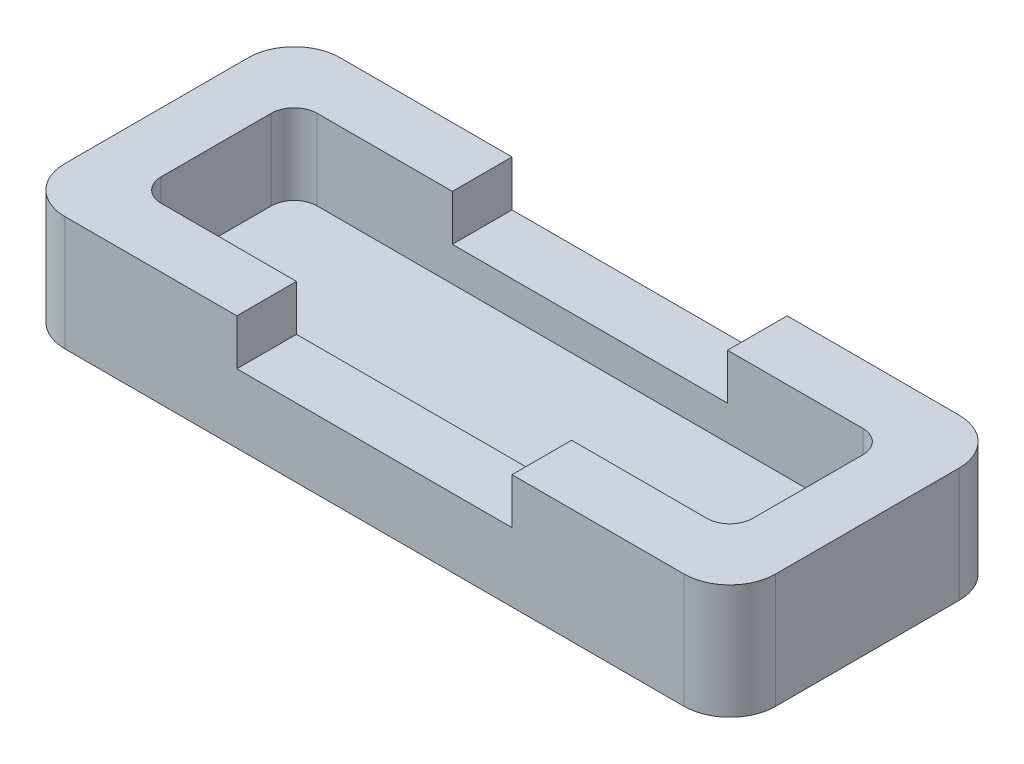
ISO-10303-21;
HEADER;
FILE_DESCRIPTION(('STEP AP214'),'2;1');
FILE_NAME('part.step','',(''),(''),'','','');
FILE_SCHEMA(('AUTOMOTIVE_DESIGN { 1 0 10303 214 1 1 1 1 }'));
ENDSEC;
DATA;
#1=APPLICATION_CONTEXT('core data for automotive mechanical design processes');
#2=APPLICATION_PROTOCOL_DEFINITION('international standard','automotive_design',2000,#1);
#3=PRODUCT_CONTEXT('',#1,'mechanical');
#4=PRODUCT('Part','Part','',(#3));
#5=PRODUCT_RELATED_PRODUCT_CATEGORY('part','',(#4));
#6=PRODUCT_DEFINITION_FORMATION('','',#4);
#7=PRODUCT_DEFINITION_CONTEXT('part definition',#1,'design');
#8=PRODUCT_DEFINITION('design','',#6,#7);
#9=PRODUCT_DEFINITION_SHAPE('','',#8);
#10=(LENGTH_UNIT() NAMED_UNIT(*) SI_UNIT(.MILLI.,.METRE.));
#11=(NAMED_UNIT(*) PLANE_ANGLE_UNIT() SI_UNIT($,.RADIAN.));
#12=(NAMED_UNIT(*) SI_UNIT($,.STERADIAN.) SOLID_ANGLE_UNIT());
#13=UNCERTAINTY_MEASURE_WITH_UNIT(LENGTH_MEASURE(1.E-05),#10,'distance_accuracy_value','');
#14=(GEOMETRIC_REPRESENTATION_CONTEXT(3) GLOBAL_UNCERTAINTY_ASSIGNED_CONTEXT((#13)) GLOBAL_UNIT_ASSIGNED_CONTEXT((#10,
#11,#12)) REPRESENTATION_CONTEXT('',''));
#15=CARTESIAN_POINT('',(0.,0.,0.));
#16=DIRECTION('',(0.,0.,1.));
#17=DIRECTION('',(1.,0.,0.));
#18=AXIS2_PLACEMENT_3D('',#15,#16,#17);
#19=CARTESIAN_POINT('',(0.,5.,0.));
#20=DIRECTION('',(0.,1.,0.));
#21=DIRECTION('',(0.,0.,1.));
#22=AXIS2_PLACEMENT_3D('',#19,#20,#21);
#23=PLANE('',#22);
#24=DIRECTION('',(1.,0.,0.));
#25=VECTOR('',#24,1.);
#26=CARTESIAN_POINT('',(-15.5,5.,6.));
#27=LINE('',#26,#25);
#28=CARTESIAN_POINT('',(6.,5.,6.));
#29=VERTEX_POINT('',#28);
#30=CARTESIAN_POINT('',(13.5,5.,6.));
#31=VERTEX_POINT('',#30);
#32=EDGE_CURVE('E280',#29,#31,#27,.T.);
#33=ORIENTED_EDGE('',*,*,#32,.T.);
#34=CARTESIAN_POINT('',(13.5,5.,4.));
#35=DIRECTION('',(0.,1.,0.));
#36=DIRECTION('',(0.,0.,1.));
#37=AXIS2_PLACEMENT_3D('',#34,#35,#36);
#38=CIRCLE('',#37,2.);
#39=CARTESIAN_POINT('',(15.5,5.,4.));
#40=VERTEX_POINT('',#39);
#41=EDGE_CURVE('E321',#31,#40,#38,.T.);
#42=ORIENTED_EDGE('',*,*,#41,.T.);
#43=DIRECTION('',(0.,0.,-1.));
#44=VECTOR('',#43,1.);
#45=CARTESIAN_POINT('',(15.5,5.,-6.));
#46=LINE('',#45,#44);
#47=CARTESIAN_POINT('',(15.5,5.,-4.));
#48=VERTEX_POINT('',#47);
#49=EDGE_CURVE('E270',#40,#48,#46,.T.);
#50=ORIENTED_EDGE('',*,*,#49,.T.);
#51=CARTESIAN_POINT('',(13.5,5.,-4.));
#52=DIRECTION('',(0.,1.,0.));
#53=DIRECTION('',(0.,0.,1.));
#54=AXIS2_PLACEMENT_3D('',#51,#52,#53);
#55=CIRCLE('',#54,2.);
#56=CARTESIAN_POINT('',(13.5,5.,-6.));
#57=VERTEX_POINT('',#56);
#58=EDGE_CURVE('E319',#48,#57,#55,.T.);
#59=ORIENTED_EDGE('',*,*,#58,.T.);
#60=DIRECTION('',(-1.,0.,0.));
#61=VECTOR('',#60,1.);
#62=CARTESIAN_POINT('',(-15.5,5.,-6.));
#63=LINE('',#62,#61);
#64=CARTESIAN_POINT('',(6.,5.,-6.));
#65=VERTEX_POINT('',#64);
#66=EDGE_CURVE('E275',#57,#65,#63,.T.);
#67=ORIENTED_EDGE('',*,*,#66,.T.);
#68=DIRECTION('',(0.,0.,-1.));
#69=VECTOR('',#68,1.);
#70=CARTESIAN_POINT('',(6.,5.,6.));
#71=LINE('',#70,#69);
#72=CARTESIAN_POINT('',(6.,5.,-3.4));
#73=VERTEX_POINT('',#72);
#74=EDGE_CURVE('E215',#73,#65,#71,.T.);
#75=ORIENTED_EDGE('',*,*,#74,.F.);
#76=DIRECTION('',(-1.,0.,0.));
#77=VECTOR('',#76,1.);
#78=CARTESIAN_POINT('',(-15.5,5.,-3.4));
#79=LINE('',#78,#77);
#80=CARTESIAN_POINT('',(11.9,5.,-3.4));
#81=VERTEX_POINT('',#80);
#82=EDGE_CURVE('E261',#81,#73,#79,.T.);
#83=ORIENTED_EDGE('',*,*,#82,.F.);
#84=CARTESIAN_POINT('',(11.9,5.,-2.4));
#85=DIRECTION('',(0.,1.,0.));
#86=DIRECTION('',(0.,0.,1.));
#87=AXIS2_PLACEMENT_3D('',#84,#85,#86);
#88=CIRCLE('',#87,1.);
#89=CARTESIAN_POINT('',(12.9,5.,-2.4));
#90=VERTEX_POINT('',#89);
#91=EDGE_CURVE('E11',#81,#90,#88,.F.);
#92=ORIENTED_EDGE('',*,*,#91,.T.);
#93=DIRECTION('',(0.,0.,-1.));
#94=VECTOR('',#93,1.);
#95=CARTESIAN_POINT('',(12.9,5.,-6.));
#96=LINE('',#95,#94);
#97=CARTESIAN_POINT('',(12.9,5.,2.4));
#98=VERTEX_POINT('',#97);
#99=EDGE_CURVE('E258',#98,#90,#96,.T.);
#100=ORIENTED_EDGE('',*,*,#99,.F.);
#101=CARTESIAN_POINT('',(11.9,5.,2.4));
#102=DIRECTION('',(0.,1.,0.));
#103=DIRECTION('',(0.,0.,1.));
#104=AXIS2_PLACEMENT_3D('',#101,#102,#103);
#105=CIRCLE('',#104,1.);
#106=CARTESIAN_POINT('',(11.9,5.,3.4));
#107=VERTEX_POINT('',#106);
#108=EDGE_CURVE('E43',#98,#107,#105,.F.);
#109=ORIENTED_EDGE('',*,*,#108,.T.);
#110=DIRECTION('',(1.,0.,0.));
#111=VECTOR('',#110,1.);
#112=CARTESIAN_POINT('',(-15.5,5.,3.4));
#113=LINE('',#112,#111);
#114=CARTESIAN_POINT('',(6.,5.,3.4));
#115=VERTEX_POINT('',#114);
#116=EDGE_CURVE('E266',#115,#107,#113,.T.);
#117=ORIENTED_EDGE('',*,*,#116,.F.);
#118=EDGE_CURVE('E230',#29,#115,#71,.T.);
#119=ORIENTED_EDGE('',*,*,#118,.F.);
#120=EDGE_LOOP('',(#33,#42,#50,#59,#67,#75,#83,#92,#100,#109,#117,#119));
#121=FACE_BOUND('',#120,.T.);
#122=ADVANCED_FACE('F35',(#121),#23,.T.);
#123=CARTESIAN_POINT('',(15.5,5.,-6.));
#124=DIRECTION('',(-1.,0.,0.));
#125=DIRECTION('',(0.,0.,1.));
#126=AXIS2_PLACEMENT_3D('',#123,#124,#125);
#127=PLANE('',#126);
#128=ORIENTED_EDGE('',*,*,#49,.F.);
#129=DIRECTION('',(0.,-1.,0.));
#130=VECTOR('',#129,1.);
#131=CARTESIAN_POINT('',(15.5,5.,4.));
#132=LINE('',#131,#130);
#133=CARTESIAN_POINT('',(15.5,0.,4.));
#134=VERTEX_POINT('',#133);
#135=EDGE_CURVE('E303',#40,#134,#132,.T.);
#136=ORIENTED_EDGE('',*,*,#135,.T.);
#137=DIRECTION('',(0.,0.,-1.));
#138=VECTOR('',#137,1.);
#139=CARTESIAN_POINT('',(15.5,0.,-6.));
#140=LINE('',#139,#138);
#141=CARTESIAN_POINT('',(15.5,0.,-4.));
#142=VERTEX_POINT('',#141);
#143=EDGE_CURVE('E269',#134,#142,#140,.T.);
#144=ORIENTED_EDGE('',*,*,#143,.T.);
#145=DIRECTION('',(0.,-1.,0.));
#146=VECTOR('',#145,1.);
#147=CARTESIAN_POINT('',(15.5,5.,-4.));
#148=LINE('',#147,#146);
#149=EDGE_CURVE('E301',#142,#48,#148,.F.);
#150=ORIENTED_EDGE('',*,*,#149,.T.);
#151=EDGE_LOOP('',(#128,#136,#144,#150));
#152=FACE_BOUND('',#151,.T.);
#153=ADVANCED_FACE('F437',(#152),#127,.F.);
#154=CARTESIAN_POINT('',(-15.5,5.,-6.));
#155=DIRECTION('',(0.,0.,1.));
#156=DIRECTION('',(1.,0.,0.));
#157=AXIS2_PLACEMENT_3D('',#154,#155,#156);
#158=PLANE('',#157);
#159=ORIENTED_EDGE('',*,*,#66,.F.);
#160=DIRECTION('',(0.,-1.,0.));
#161=VECTOR('',#160,1.);
#162=CARTESIAN_POINT('',(13.5,5.,-6.));
#163=LINE('',#162,#161);
#164=CARTESIAN_POINT('',(13.5,0.,-6.));
#165=VERTEX_POINT('',#164);
#166=EDGE_CURVE('E325',#57,#165,#163,.T.);
#167=ORIENTED_EDGE('',*,*,#166,.T.);
#168=DIRECTION('',(-1.,0.,0.));
#169=VECTOR('',#168,1.);
#170=CARTESIAN_POINT('',(-15.5,0.,-6.));
#171=LINE('',#170,#169);
#172=CARTESIAN_POINT('',(-13.5,0.,-6.));
#173=VERTEX_POINT('',#172);
#174=EDGE_CURVE('E286',#165,#173,#171,.T.);
#175=ORIENTED_EDGE('',*,*,#174,.T.);
#176=DIRECTION('',(0.,-1.,0.));
#177=VECTOR('',#176,1.);
#178=CARTESIAN_POINT('',(-13.5,5.,-6.));
#179=LINE('',#178,#177);
#180=CARTESIAN_POINT('',(-13.5,5.,-6.));
#181=VERTEX_POINT('',#180);
#182=EDGE_CURVE('E323',#173,#181,#179,.F.);
#183=ORIENTED_EDGE('',*,*,#182,.T.);
#184=CARTESIAN_POINT('',(-6.,5.,-6.));
#185=VERTEX_POINT('',#184);
#186=EDGE_CURVE('E273',#185,#181,#63,.T.);
#187=ORIENTED_EDGE('',*,*,#186,.F.);
#188=DIRECTION('',(0.,1.,0.));
#189=VECTOR('',#188,1.);
#190=CARTESIAN_POINT('',(-6.,3.,-6.));
#191=LINE('',#190,#189);
#192=CARTESIAN_POINT('',(-6.,3.,-6.));
#193=VERTEX_POINT('',#192);
#194=EDGE_CURVE('E218',#193,#185,#191,.T.);
#195=ORIENTED_EDGE('',*,*,#194,.F.);
#196=DIRECTION('',(-1.,0.,0.));
#197=VECTOR('',#196,1.);
#198=CARTESIAN_POINT('',(-6.,3.,-6.));
#199=LINE('',#198,#197);
#200=CARTESIAN_POINT('',(6.,3.,-6.));
#201=VERTEX_POINT('',#200);
#202=EDGE_CURVE('E200',#201,#193,#199,.T.);
#203=ORIENTED_EDGE('',*,*,#202,.F.);
#204=DIRECTION('',(0.,1.,0.));
#205=VECTOR('',#204,1.);
#206=CARTESIAN_POINT('',(6.,3.,-6.));
#207=LINE('',#206,#205);
#208=EDGE_CURVE('E212',#201,#65,#207,.T.);
#209=ORIENTED_EDGE('',*,*,#208,.T.);
#210=EDGE_LOOP('',(#159,#167,#175,#183,#187,#195,#203,#209));
#211=FACE_BOUND('',#210,.T.);
#212=ADVANCED_FACE('F221',(#211),#158,.F.);
#213=CARTESIAN_POINT('',(-15.5,5.,-6.));
#214=DIRECTION('',(1.,0.,0.));
#215=DIRECTION('',(0.,0.,-1.));
#216=AXIS2_PLACEMENT_3D('',#213,#214,#215);
#217=PLANE('',#216);
#218=DIRECTION('',(0.,0.,1.));
#219=VECTOR('',#218,1.);
#220=CARTESIAN_POINT('',(-15.5,5.,-6.));
#221=LINE('',#220,#219);
#222=CARTESIAN_POINT('',(-15.5,5.,-4.));
#223=VERTEX_POINT('',#222);
#224=CARTESIAN_POINT('',(-15.5,5.,4.));
#225=VERTEX_POINT('',#224);
#226=EDGE_CURVE('E277',#223,#225,#221,.T.);
#227=ORIENTED_EDGE('',*,*,#226,.F.);
#228=DIRECTION('',(0.,-1.,0.));
#229=VECTOR('',#228,1.);
#230=CARTESIAN_POINT('',(-15.5,5.,-4.));
#231=LINE('',#230,#229);
#232=CARTESIAN_POINT('',(-15.5,0.,-4.));
#233=VERTEX_POINT('',#232);
#234=EDGE_CURVE('E330',#223,#233,#231,.T.);
#235=ORIENTED_EDGE('',*,*,#234,.T.);
#236=DIRECTION('',(0.,0.,1.));
#237=VECTOR('',#236,1.);
#238=CARTESIAN_POINT('',(-15.5,0.,-6.));
#239=LINE('',#238,#237);
#240=CARTESIAN_POINT('',(-15.5,0.,4.));
#241=VERTEX_POINT('',#240);
#242=EDGE_CURVE('E289',#233,#241,#239,.T.);
#243=ORIENTED_EDGE('',*,*,#242,.T.);
#244=DIRECTION('',(0.,-1.,0.));
#245=VECTOR('',#244,1.);
#246=CARTESIAN_POINT('',(-15.5,5.,4.));
#247=LINE('',#246,#245);
#248=EDGE_CURVE('E328',#241,#225,#247,.F.);
#249=ORIENTED_EDGE('',*,*,#248,.T.);
#250=EDGE_LOOP('',(#227,#235,#243,#249));
#251=FACE_BOUND('',#250,.T.);
#252=ADVANCED_FACE('F454',(#251),#217,.F.);
#253=CARTESIAN_POINT('',(-15.5,5.,6.));
#254=DIRECTION('',(0.,0.,-1.));
#255=DIRECTION('',(-1.,0.,0.));
#256=AXIS2_PLACEMENT_3D('',#253,#254,#255);
#257=PLANE('',#256);
#258=DIRECTION('',(1.,0.,0.));
#259=VECTOR('',#258,1.);
#260=CARTESIAN_POINT('',(-15.5,0.,6.));
#261=LINE('',#260,#259);
#262=CARTESIAN_POINT('',(-13.5,0.,6.));
#263=VERTEX_POINT('',#262);
#264=CARTESIAN_POINT('',(13.5,0.,6.));
#265=VERTEX_POINT('',#264);
#266=EDGE_CURVE('E274',#263,#265,#261,.T.);
#267=ORIENTED_EDGE('',*,*,#266,.T.);
#268=DIRECTION('',(0.,-1.,0.));
#269=VECTOR('',#268,1.);
#270=CARTESIAN_POINT('',(13.5,5.,6.));
#271=LINE('',#270,#269);
#272=EDGE_CURVE('E317',#265,#31,#271,.F.);
#273=ORIENTED_EDGE('',*,*,#272,.T.);
#274=ORIENTED_EDGE('',*,*,#32,.F.);
#275=DIRECTION('',(0.,1.,0.));
#276=VECTOR('',#275,1.);
#277=CARTESIAN_POINT('',(6.,3.,6.));
#278=LINE('',#277,#276);
#279=CARTESIAN_POINT('',(6.,3.,6.));
#280=VERTEX_POINT('',#279);
#281=EDGE_CURVE('E234',#280,#29,#278,.T.);
#282=ORIENTED_EDGE('',*,*,#281,.F.);
#283=DIRECTION('',(1.,0.,0.));
#284=VECTOR('',#283,1.);
#285=CARTESIAN_POINT('',(-6.,3.,6.));
#286=LINE('',#285,#284);
#287=CARTESIAN_POINT('',(-6.,3.,6.));
#288=VERTEX_POINT('',#287);
#289=EDGE_CURVE('E219',#288,#280,#286,.T.);
#290=ORIENTED_EDGE('',*,*,#289,.F.);
#291=DIRECTION('',(0.,1.,0.));
#292=VECTOR('',#291,1.);
#293=CARTESIAN_POINT('',(-6.,3.,6.));
#294=LINE('',#293,#292);
#295=CARTESIAN_POINT('',(-6.,5.,6.));
#296=VERTEX_POINT('',#295);
#297=EDGE_CURVE('E236',#288,#296,#294,.T.);
#298=ORIENTED_EDGE('',*,*,#297,.T.);
#299=CARTESIAN_POINT('',(-13.5,5.,6.));
#300=VERTEX_POINT('',#299);
#301=EDGE_CURVE('E281',#300,#296,#27,.T.);
#302=ORIENTED_EDGE('',*,*,#301,.F.);
#303=DIRECTION('',(0.,-1.,0.));
#304=VECTOR('',#303,1.);
#305=CARTESIAN_POINT('',(-13.5,5.,6.));
#306=LINE('',#305,#304);
#307=EDGE_CURVE('E314',#300,#263,#306,.T.);
#308=ORIENTED_EDGE('',*,*,#307,.T.);
#309=EDGE_LOOP('',(#267,#273,#274,#282,#290,#298,#302,#308));
#310=FACE_BOUND('',#309,.T.);
#311=ADVANCED_FACE('F420',(#310),#257,.F.);
#312=ORIENTED_EDGE('',*,*,#186,.T.);
#313=CARTESIAN_POINT('',(-13.5,5.,-4.));
#314=DIRECTION('',(0.,1.,0.));
#315=DIRECTION('',(0.,0.,1.));
#316=AXIS2_PLACEMENT_3D('',#313,#314,#315);
#317=CIRCLE('',#316,2.);
#318=EDGE_CURVE('E335',#181,#223,#317,.T.);
#319=ORIENTED_EDGE('',*,*,#318,.T.);
#320=ORIENTED_EDGE('',*,*,#226,.T.);
#321=CARTESIAN_POINT('',(-13.5,5.,4.));
#322=DIRECTION('',(0.,1.,0.));
#323=DIRECTION('',(0.,0.,1.));
#324=AXIS2_PLACEMENT_3D('',#321,#322,#323);
#325=CIRCLE('',#324,2.);
#326=EDGE_CURVE('E333',#225,#300,#325,.T.);
#327=ORIENTED_EDGE('',*,*,#326,.T.);
#328=ORIENTED_EDGE('',*,*,#301,.T.);
#329=DIRECTION('',(0.,0.,1.));
#330=VECTOR('',#329,1.);
#331=CARTESIAN_POINT('',(-6.,5.,6.));
#332=LINE('',#331,#330);
#333=CARTESIAN_POINT('',(-6.,5.,3.4));
#334=VERTEX_POINT('',#333);
#335=EDGE_CURVE('E232',#334,#296,#332,.T.);
#336=ORIENTED_EDGE('',*,*,#335,.F.);
#337=CARTESIAN_POINT('',(-11.9,5.,3.4));
#338=VERTEX_POINT('',#337);
#339=EDGE_CURVE('E267',#338,#334,#113,.T.);
#340=ORIENTED_EDGE('',*,*,#339,.F.);
#341=CARTESIAN_POINT('',(-11.9,5.,2.4));
#342=DIRECTION('',(0.,1.,0.));
#343=DIRECTION('',(0.,0.,1.));
#344=AXIS2_PLACEMENT_3D('',#341,#342,#343);
#345=CIRCLE('',#344,1.);
#346=CARTESIAN_POINT('',(-12.9,5.,2.4));
#347=VERTEX_POINT('',#346);
#348=EDGE_CURVE('E366',#338,#347,#345,.F.);
#349=ORIENTED_EDGE('',*,*,#348,.T.);
#350=DIRECTION('',(0.,0.,1.));
#351=VECTOR('',#350,1.);
#352=CARTESIAN_POINT('',(-12.9,5.,-6.));
#353=LINE('',#352,#351);
#354=CARTESIAN_POINT('',(-12.9,5.,-2.4));
#355=VERTEX_POINT('',#354);
#356=EDGE_CURVE('E263',#355,#347,#353,.T.);
#357=ORIENTED_EDGE('',*,*,#356,.F.);
#358=CARTESIAN_POINT('',(-11.9,5.,-2.4));
#359=DIRECTION('',(0.,1.,0.));
#360=DIRECTION('',(0.,0.,1.));
#361=AXIS2_PLACEMENT_3D('',#358,#359,#360);
#362=CIRCLE('',#361,1.);
#363=CARTESIAN_POINT('',(-11.9,5.,-3.4));
#364=VERTEX_POINT('',#363);
#365=EDGE_CURVE('E364',#355,#364,#362,.F.);
#366=ORIENTED_EDGE('',*,*,#365,.T.);
#367=CARTESIAN_POINT('',(-6.,5.,-3.4));
#368=VERTEX_POINT('',#367);
#369=EDGE_CURVE('E260',#368,#364,#79,.T.);
#370=ORIENTED_EDGE('',*,*,#369,.F.);
#371=EDGE_CURVE('E208',#185,#368,#332,.T.);
#372=ORIENTED_EDGE('',*,*,#371,.F.);
#373=EDGE_LOOP('',(#312,#319,#320,#327,#328,#336,#340,#349,#357,#366,#370,#372));
#374=FACE_BOUND('',#373,.T.);
#375=ADVANCED_FACE('F411',(#374),#23,.T.);
#376=CARTESIAN_POINT('',(0.,0.,0.));
#377=DIRECTION('',(0.,1.,0.));
#378=DIRECTION('',(0.,0.,1.));
#379=AXIS2_PLACEMENT_3D('',#376,#377,#378);
#380=PLANE('',#379);
#381=ORIENTED_EDGE('',*,*,#143,.F.);
#382=CARTESIAN_POINT('',(13.5,0.,4.));
#383=DIRECTION('',(0.,1.,0.));
#384=DIRECTION('',(0.,0.,1.));
#385=AXIS2_PLACEMENT_3D('',#382,#383,#384);
#386=CIRCLE('',#385,2.);
#387=EDGE_CURVE('E312',#134,#265,#386,.F.);
#388=ORIENTED_EDGE('',*,*,#387,.T.);
#389=ORIENTED_EDGE('',*,*,#266,.F.);
#390=CARTESIAN_POINT('',(-13.5,0.,4.));
#391=DIRECTION('',(0.,1.,0.));
#392=DIRECTION('',(0.,0.,1.));
#393=AXIS2_PLACEMENT_3D('',#390,#391,#392);
#394=CIRCLE('',#393,2.);
#395=EDGE_CURVE('E306',#263,#241,#394,.F.);
#396=ORIENTED_EDGE('',*,*,#395,.T.);
#397=ORIENTED_EDGE('',*,*,#242,.F.);
#398=CARTESIAN_POINT('',(-13.5,0.,-4.));
#399=DIRECTION('',(0.,1.,0.));
#400=DIRECTION('',(0.,0.,1.));
#401=AXIS2_PLACEMENT_3D('',#398,#399,#400);
#402=CIRCLE('',#401,2.);
#403=EDGE_CURVE('E308',#233,#173,#402,.F.);
#404=ORIENTED_EDGE('',*,*,#403,.T.);
#405=ORIENTED_EDGE('',*,*,#174,.F.);
#406=CARTESIAN_POINT('',(13.5,0.,-4.));
#407=DIRECTION('',(0.,1.,0.));
#408=DIRECTION('',(0.,0.,1.));
#409=AXIS2_PLACEMENT_3D('',#406,#407,#408);
#410=CIRCLE('',#409,2.);
#411=EDGE_CURVE('E310',#165,#142,#410,.F.);
#412=ORIENTED_EDGE('',*,*,#411,.T.);
#413=EDGE_LOOP('',(#381,#388,#389,#396,#397,#404,#405,#412));
#414=FACE_BOUND('',#413,.T.);
#415=ADVANCED_FACE('F446',(#414),#380,.F.);
#416=CARTESIAN_POINT('',(12.9,5.,-6.));
#417=DIRECTION('',(-1.,0.,0.));
#418=DIRECTION('',(0.,0.,1.));
#419=AXIS2_PLACEMENT_3D('',#416,#417,#418);
#420=PLANE('',#419);
#421=DIRECTION('',(0.,0.,-1.));
#422=VECTOR('',#421,1.);
#423=CARTESIAN_POINT('',(12.9,1.5,-6.));
#424=LINE('',#423,#422);
#425=CARTESIAN_POINT('',(12.9,1.5,2.4));
#426=VERTEX_POINT('',#425);
#427=CARTESIAN_POINT('',(12.9,1.5,-2.4));
#428=VERTEX_POINT('',#427);
#429=EDGE_CURVE('E246',#426,#428,#424,.T.);
#430=ORIENTED_EDGE('',*,*,#429,.F.);
#431=DIRECTION('',(0.,-1.,0.));
#432=VECTOR('',#431,1.);
#433=CARTESIAN_POINT('',(12.9,5.,2.4));
#434=LINE('',#433,#432);
#435=EDGE_CURVE('E55',#426,#98,#434,.F.);
#436=ORIENTED_EDGE('',*,*,#435,.T.);
#437=ORIENTED_EDGE('',*,*,#99,.T.);
#438=DIRECTION('',(0.,-1.,0.));
#439=VECTOR('',#438,1.);
#440=CARTESIAN_POINT('',(12.9,1.5,-2.4));
#441=LINE('',#440,#439);
#442=EDGE_CURVE('E360',#90,#428,#441,.T.);
#443=ORIENTED_EDGE('',*,*,#442,.T.);
#444=EDGE_LOOP('',(#430,#436,#437,#443));
#445=FACE_BOUND('',#444,.T.);
#446=ADVANCED_FACE('F382',(#445),#420,.T.);
#447=CARTESIAN_POINT('',(-15.5,5.,-3.4));
#448=DIRECTION('',(0.,0.,1.));
#449=DIRECTION('',(1.,0.,0.));
#450=AXIS2_PLACEMENT_3D('',#447,#448,#449);
#451=PLANE('',#450);
#452=ORIENTED_EDGE('',*,*,#369,.T.);
#453=DIRECTION('',(0.,-1.,0.));
#454=VECTOR('',#453,1.);
#455=CARTESIAN_POINT('',(-11.9,1.5,-3.4));
#456=LINE('',#455,#454);
#457=CARTESIAN_POINT('',(-11.9,1.5,-3.4));
#458=VERTEX_POINT('',#457);
#459=EDGE_CURVE('E339',#364,#458,#456,.T.);
#460=ORIENTED_EDGE('',*,*,#459,.T.);
#461=DIRECTION('',(-1.,0.,0.));
#462=VECTOR('',#461,1.);
#463=CARTESIAN_POINT('',(-15.5,1.5,-3.4));
#464=LINE('',#463,#462);
#465=CARTESIAN_POINT('',(11.9,1.5,-3.4));
#466=VERTEX_POINT('',#465);
#467=EDGE_CURVE('E249',#466,#458,#464,.T.);
#468=ORIENTED_EDGE('',*,*,#467,.F.);
#469=DIRECTION('',(0.,-1.,0.));
#470=VECTOR('',#469,1.);
#471=CARTESIAN_POINT('',(11.9,5.,-3.4));
#472=LINE('',#471,#470);
#473=EDGE_CURVE('E337',#466,#81,#472,.F.);
#474=ORIENTED_EDGE('',*,*,#473,.T.);
#475=ORIENTED_EDGE('',*,*,#82,.T.);
#476=DIRECTION('',(0.,1.,0.));
#477=VECTOR('',#476,1.);
#478=CARTESIAN_POINT('',(6.,5.,-3.4));
#479=LINE('',#478,#477);
#480=CARTESIAN_POINT('',(6.,3.,-3.4));
#481=VERTEX_POINT('',#480);
#482=EDGE_CURVE('E244',#481,#73,#479,.T.);
#483=ORIENTED_EDGE('',*,*,#482,.F.);
#484=DIRECTION('',(1.,0.,0.));
#485=VECTOR('',#484,1.);
#486=CARTESIAN_POINT('',(-15.5,3.,-3.4));
#487=LINE('',#486,#485);
#488=CARTESIAN_POINT('',(-6.,3.,-3.4));
#489=VERTEX_POINT('',#488);
#490=EDGE_CURVE('E203',#489,#481,#487,.T.);
#491=ORIENTED_EDGE('',*,*,#490,.F.);
#492=DIRECTION('',(0.,-1.,0.));
#493=VECTOR('',#492,1.);
#494=CARTESIAN_POINT('',(-6.,5.,-3.4));
#495=LINE('',#494,#493);
#496=EDGE_CURVE('E241',#368,#489,#495,.T.);
#497=ORIENTED_EDGE('',*,*,#496,.F.);
#498=EDGE_LOOP('',(#452,#460,#468,#474,#475,#483,#491,#497));
#499=FACE_BOUND('',#498,.T.);
#500=ADVANCED_FACE('F389',(#499),#451,.T.);
#501=CARTESIAN_POINT('',(-12.9,5.,-6.));
#502=DIRECTION('',(1.,0.,0.));
#503=DIRECTION('',(0.,0.,-1.));
#504=AXIS2_PLACEMENT_3D('',#501,#502,#503);
#505=PLANE('',#504);
#506=DIRECTION('',(0.,0.,1.));
#507=VECTOR('',#506,1.);
#508=CARTESIAN_POINT('',(-12.9,1.5,-6.));
#509=LINE('',#508,#507);
#510=CARTESIAN_POINT('',(-12.9,1.5,-2.4));
#511=VERTEX_POINT('',#510);
#512=CARTESIAN_POINT('',(-12.9,1.5,2.4));
#513=VERTEX_POINT('',#512);
#514=EDGE_CURVE('E252',#511,#513,#509,.T.);
#515=ORIENTED_EDGE('',*,*,#514,.F.);
#516=DIRECTION('',(0.,-1.,0.));
#517=VECTOR('',#516,1.);
#518=CARTESIAN_POINT('',(-12.9,5.,-2.4));
#519=LINE('',#518,#517);
#520=EDGE_CURVE('E353',#511,#355,#519,.F.);
#521=ORIENTED_EDGE('',*,*,#520,.T.);
#522=ORIENTED_EDGE('',*,*,#356,.T.);
#523=DIRECTION('',(0.,-1.,0.));
#524=VECTOR('',#523,1.);
#525=CARTESIAN_POINT('',(-12.9,1.5,2.4));
#526=LINE('',#525,#524);
#527=EDGE_CURVE('E350',#347,#513,#526,.T.);
#528=ORIENTED_EDGE('',*,*,#527,.T.);
#529=EDGE_LOOP('',(#515,#521,#522,#528));
#530=FACE_BOUND('',#529,.T.);
#531=ADVANCED_FACE('F399',(#530),#505,.T.);
#532=CARTESIAN_POINT('',(-15.5,5.,3.4));
#533=DIRECTION('',(0.,0.,-1.));
#534=DIRECTION('',(-1.,0.,0.));
#535=AXIS2_PLACEMENT_3D('',#532,#533,#534);
#536=PLANE('',#535);
#537=DIRECTION('',(1.,0.,0.));
#538=VECTOR('',#537,1.);
#539=CARTESIAN_POINT('',(-15.5,1.5,3.4));
#540=LINE('',#539,#538);
#541=CARTESIAN_POINT('',(-11.9,1.5,3.4));
#542=VERTEX_POINT('',#541);
#543=CARTESIAN_POINT('',(11.9,1.5,3.4));
#544=VERTEX_POINT('',#543);
#545=EDGE_CURVE('E255',#542,#544,#540,.T.);
#546=ORIENTED_EDGE('',*,*,#545,.F.);
#547=DIRECTION('',(0.,-1.,0.));
#548=VECTOR('',#547,1.);
#549=CARTESIAN_POINT('',(-11.9,5.,3.4));
#550=LINE('',#549,#548);
#551=EDGE_CURVE('E358',#542,#338,#550,.F.);
#552=ORIENTED_EDGE('',*,*,#551,.T.);
#553=ORIENTED_EDGE('',*,*,#339,.T.);
#554=DIRECTION('',(0.,1.,0.));
#555=VECTOR('',#554,1.);
#556=CARTESIAN_POINT('',(-6.,5.,3.4));
#557=LINE('',#556,#555);
#558=CARTESIAN_POINT('',(-6.,3.,3.4));
#559=VERTEX_POINT('',#558);
#560=EDGE_CURVE('E295',#559,#334,#557,.T.);
#561=ORIENTED_EDGE('',*,*,#560,.F.);
#562=DIRECTION('',(-1.,0.,0.));
#563=VECTOR('',#562,1.);
#564=CARTESIAN_POINT('',(-15.5,3.,3.4));
#565=LINE('',#564,#563);
#566=CARTESIAN_POINT('',(6.,3.,3.4));
#567=VERTEX_POINT('',#566);
#568=EDGE_CURVE('E283',#567,#559,#565,.T.);
#569=ORIENTED_EDGE('',*,*,#568,.F.);
#570=DIRECTION('',(0.,-1.,0.));
#571=VECTOR('',#570,1.);
#572=CARTESIAN_POINT('',(6.,5.,3.4));
#573=LINE('',#572,#571);
#574=EDGE_CURVE('E298',#115,#567,#573,.T.);
#575=ORIENTED_EDGE('',*,*,#574,.F.);
#576=ORIENTED_EDGE('',*,*,#116,.T.);
#577=DIRECTION('',(0.,-1.,0.));
#578=VECTOR('',#577,1.);
#579=CARTESIAN_POINT('',(11.9,1.5,3.4));
#580=LINE('',#579,#578);
#581=EDGE_CURVE('E355',#107,#544,#580,.T.);
#582=ORIENTED_EDGE('',*,*,#581,.T.);
#583=EDGE_LOOP('',(#546,#552,#553,#561,#569,#575,#576,#582));
#584=FACE_BOUND('',#583,.T.);
#585=ADVANCED_FACE('F377',(#584),#536,.T.);
#586=CARTESIAN_POINT('',(0.,1.5,0.));
#587=DIRECTION('',(0.,1.,0.));
#588=DIRECTION('',(0.,0.,1.));
#589=AXIS2_PLACEMENT_3D('',#586,#587,#588);
#590=PLANE('',#589);
#591=ORIENTED_EDGE('',*,*,#467,.T.);
#592=CARTESIAN_POINT('',(-11.9,1.5,-2.4));
#593=DIRECTION('',(0.,1.,0.));
#594=DIRECTION('',(0.,0.,1.));
#595=AXIS2_PLACEMENT_3D('',#592,#593,#594);
#596=CIRCLE('',#595,1.);
#597=EDGE_CURVE('E348',#458,#511,#596,.T.);
#598=ORIENTED_EDGE('',*,*,#597,.T.);
#599=ORIENTED_EDGE('',*,*,#514,.T.);
#600=CARTESIAN_POINT('',(-11.9,1.5,2.4));
#601=DIRECTION('',(0.,1.,0.));
#602=DIRECTION('',(0.,0.,1.));
#603=AXIS2_PLACEMENT_3D('',#600,#601,#602);
#604=CIRCLE('',#603,1.);
#605=EDGE_CURVE('E346',#513,#542,#604,.T.);
#606=ORIENTED_EDGE('',*,*,#605,.T.);
#607=ORIENTED_EDGE('',*,*,#545,.T.);
#608=CARTESIAN_POINT('',(11.9,1.5,2.4));
#609=DIRECTION('',(0.,1.,0.));
#610=DIRECTION('',(0.,0.,1.));
#611=AXIS2_PLACEMENT_3D('',#608,#609,#610);
#612=CIRCLE('',#611,1.);
#613=EDGE_CURVE('E344',#544,#426,#612,.T.);
#614=ORIENTED_EDGE('',*,*,#613,.T.);
#615=ORIENTED_EDGE('',*,*,#429,.T.);
#616=CARTESIAN_POINT('',(11.9,1.5,-2.4));
#617=DIRECTION('',(0.,1.,0.));
#618=DIRECTION('',(0.,0.,1.));
#619=AXIS2_PLACEMENT_3D('',#616,#617,#618);
#620=CIRCLE('',#619,1.);
#621=EDGE_CURVE('E342',#428,#466,#620,.T.);
#622=ORIENTED_EDGE('',*,*,#621,.T.);
#623=EDGE_LOOP('',(#591,#598,#599,#606,#607,#614,#615,#622));
#624=FACE_BOUND('',#623,.T.);
#625=ADVANCED_FACE('F381',(#624),#590,.T.);
#626=CARTESIAN_POINT('',(0.,3.,0.));
#627=DIRECTION('',(0.,-1.,0.));
#628=DIRECTION('',(0.,0.,-1.));
#629=AXIS2_PLACEMENT_3D('',#626,#627,#628);
#630=PLANE('',#629);
#631=ORIENTED_EDGE('',*,*,#568,.T.);
#632=DIRECTION('',(0.,0.,1.));
#633=VECTOR('',#632,1.);
#634=CARTESIAN_POINT('',(-6.,3.,6.));
#635=LINE('',#634,#633);
#636=EDGE_CURVE('E223',#559,#288,#635,.T.);
#637=ORIENTED_EDGE('',*,*,#636,.T.);
#638=ORIENTED_EDGE('',*,*,#289,.T.);
#639=DIRECTION('',(0.,0.,-1.));
#640=VECTOR('',#639,1.);
#641=CARTESIAN_POINT('',(6.,3.,6.));
#642=LINE('',#641,#640);
#643=EDGE_CURVE('E207',#280,#567,#642,.T.);
#644=ORIENTED_EDGE('',*,*,#643,.T.);
#645=EDGE_LOOP('',(#631,#637,#638,#644));
#646=FACE_BOUND('',#645,.T.);
#647=ADVANCED_FACE('F425',(#646),#630,.F.);
#648=CARTESIAN_POINT('',(-6.,3.,6.));
#649=DIRECTION('',(-1.,0.,0.));
#650=DIRECTION('',(0.,0.,1.));
#651=AXIS2_PLACEMENT_3D('',#648,#649,#650);
#652=PLANE('',#651);
#653=ORIENTED_EDGE('',*,*,#560,.T.);
#654=ORIENTED_EDGE('',*,*,#335,.T.);
#655=ORIENTED_EDGE('',*,*,#297,.F.);
#656=ORIENTED_EDGE('',*,*,#636,.F.);
#657=EDGE_LOOP('',(#653,#654,#655,#656));
#658=FACE_BOUND('',#657,.T.);
#659=ADVANCED_FACE('F416',(#658),#652,.F.);
#660=CARTESIAN_POINT('',(6.,3.,6.));
#661=DIRECTION('',(1.,0.,0.));
#662=DIRECTION('',(0.,0.,-1.));
#663=AXIS2_PLACEMENT_3D('',#660,#661,#662);
#664=PLANE('',#663);
#665=ORIENTED_EDGE('',*,*,#574,.T.);
#666=ORIENTED_EDGE('',*,*,#643,.F.);
#667=ORIENTED_EDGE('',*,*,#281,.T.);
#668=ORIENTED_EDGE('',*,*,#118,.T.);
#669=EDGE_LOOP('',(#665,#666,#667,#668));
#670=FACE_BOUND('',#669,.T.);
#671=ADVANCED_FACE('F427',(#670),#664,.F.);
#672=ORIENTED_EDGE('',*,*,#482,.T.);
#673=ORIENTED_EDGE('',*,*,#74,.T.);
#674=ORIENTED_EDGE('',*,*,#208,.F.);
#675=EDGE_CURVE('E196',#481,#201,#642,.T.);
#676=ORIENTED_EDGE('',*,*,#675,.F.);
#677=EDGE_LOOP('',(#672,#673,#674,#676));
#678=FACE_BOUND('',#677,.T.);
#679=ADVANCED_FACE('F213',(#678),#664,.F.);
#680=ORIENTED_EDGE('',*,*,#496,.T.);
#681=EDGE_CURVE('E225',#193,#489,#635,.T.);
#682=ORIENTED_EDGE('',*,*,#681,.F.);
#683=ORIENTED_EDGE('',*,*,#194,.T.);
#684=ORIENTED_EDGE('',*,*,#371,.T.);
#685=EDGE_LOOP('',(#680,#682,#683,#684));
#686=FACE_BOUND('',#685,.T.);
#687=ADVANCED_FACE('F596',(#686),#652,.F.);
#688=ORIENTED_EDGE('',*,*,#490,.T.);
#689=ORIENTED_EDGE('',*,*,#675,.T.);
#690=ORIENTED_EDGE('',*,*,#202,.T.);
#691=ORIENTED_EDGE('',*,*,#681,.T.);
#692=EDGE_LOOP('',(#688,#689,#690,#691));
#693=FACE_BOUND('',#692,.T.);
#694=ADVANCED_FACE('F198',(#693),#630,.F.);
#695=CARTESIAN_POINT('',(13.5,5.,4.));
#696=DIRECTION('',(0.,-1.,0.));
#697=DIRECTION('',(0.,0.,-1.));
#698=AXIS2_PLACEMENT_3D('',#695,#696,#697);
#699=CYLINDRICAL_SURFACE('',#698,2.);
#700=ORIENTED_EDGE('',*,*,#41,.F.);
#701=ORIENTED_EDGE('',*,*,#272,.F.);
#702=ORIENTED_EDGE('',*,*,#387,.F.);
#703=ORIENTED_EDGE('',*,*,#135,.F.);
#704=EDGE_LOOP('',(#700,#701,#702,#703));
#705=FACE_BOUND('',#704,.T.);
#706=ADVANCED_FACE('F432',(#705),#699,.T.);
#707=CARTESIAN_POINT('',(13.5,5.,-4.));
#708=DIRECTION('',(0.,-1.,0.));
#709=DIRECTION('',(0.,0.,-1.));
#710=AXIS2_PLACEMENT_3D('',#707,#708,#709);
#711=CYLINDRICAL_SURFACE('',#710,2.);
#712=ORIENTED_EDGE('',*,*,#58,.F.);
#713=ORIENTED_EDGE('',*,*,#149,.F.);
#714=ORIENTED_EDGE('',*,*,#411,.F.);
#715=ORIENTED_EDGE('',*,*,#166,.F.);
#716=EDGE_LOOP('',(#712,#713,#714,#715));
#717=FACE_BOUND('',#716,.T.);
#718=ADVANCED_FACE('F441',(#717),#711,.T.);
#719=CARTESIAN_POINT('',(-13.5,5.,-4.));
#720=DIRECTION('',(0.,-1.,0.));
#721=DIRECTION('',(0.,0.,-1.));
#722=AXIS2_PLACEMENT_3D('',#719,#720,#721);
#723=CYLINDRICAL_SURFACE('',#722,2.);
#724=ORIENTED_EDGE('',*,*,#318,.F.);
#725=ORIENTED_EDGE('',*,*,#182,.F.);
#726=ORIENTED_EDGE('',*,*,#403,.F.);
#727=ORIENTED_EDGE('',*,*,#234,.F.);
#728=EDGE_LOOP('',(#724,#725,#726,#727));
#729=FACE_BOUND('',#728,.T.);
#730=ADVANCED_FACE('F451',(#729),#723,.T.);
#731=CARTESIAN_POINT('',(-13.5,5.,4.));
#732=DIRECTION('',(0.,-1.,0.));
#733=DIRECTION('',(0.,0.,-1.));
#734=AXIS2_PLACEMENT_3D('',#731,#732,#733);
#735=CYLINDRICAL_SURFACE('',#734,2.);
#736=ORIENTED_EDGE('',*,*,#326,.F.);
#737=ORIENTED_EDGE('',*,*,#248,.F.);
#738=ORIENTED_EDGE('',*,*,#395,.F.);
#739=ORIENTED_EDGE('',*,*,#307,.F.);
#740=EDGE_LOOP('',(#736,#737,#738,#739));
#741=FACE_BOUND('',#740,.T.);
#742=ADVANCED_FACE('F458',(#741),#735,.T.);
#743=CARTESIAN_POINT('',(-11.9,5.,-2.4));
#744=DIRECTION('',(0.,1.,0.));
#745=DIRECTION('',(0.,0.,1.));
#746=AXIS2_PLACEMENT_3D('',#743,#744,#745);
#747=CYLINDRICAL_SURFACE('',#746,1.);
#748=ORIENTED_EDGE('',*,*,#365,.F.);
#749=ORIENTED_EDGE('',*,*,#520,.F.);
#750=ORIENTED_EDGE('',*,*,#597,.F.);
#751=ORIENTED_EDGE('',*,*,#459,.F.);
#752=EDGE_LOOP('',(#748,#749,#750,#751));
#753=FACE_BOUND('',#752,.T.);
#754=ADVANCED_FACE('F395',(#753),#747,.F.);
#755=CARTESIAN_POINT('',(-11.9,5.,2.4));
#756=DIRECTION('',(0.,1.,0.));
#757=DIRECTION('',(0.,0.,1.));
#758=AXIS2_PLACEMENT_3D('',#755,#756,#757);
#759=CYLINDRICAL_SURFACE('',#758,1.);
#760=ORIENTED_EDGE('',*,*,#348,.F.);
#761=ORIENTED_EDGE('',*,*,#551,.F.);
#762=ORIENTED_EDGE('',*,*,#605,.F.);
#763=ORIENTED_EDGE('',*,*,#527,.F.);
#764=EDGE_LOOP('',(#760,#761,#762,#763));
#765=FACE_BOUND('',#764,.T.);
#766=ADVANCED_FACE('F404',(#765),#759,.F.);
#767=CARTESIAN_POINT('',(11.9,5.,2.4));
#768=DIRECTION('',(0.,1.,0.));
#769=DIRECTION('',(0.,0.,1.));
#770=AXIS2_PLACEMENT_3D('',#767,#768,#769);
#771=CYLINDRICAL_SURFACE('',#770,1.);
#772=ORIENTED_EDGE('',*,*,#108,.F.);
#773=ORIENTED_EDGE('',*,*,#435,.F.);
#774=ORIENTED_EDGE('',*,*,#613,.F.);
#775=ORIENTED_EDGE('',*,*,#581,.F.);
#776=EDGE_LOOP('',(#772,#773,#774,#775));
#777=FACE_BOUND('',#776,.T.);
#778=ADVANCED_FACE('F379',(#777),#771,.F.);
#779=CARTESIAN_POINT('',(11.9,5.,-2.4));
#780=DIRECTION('',(0.,1.,0.));
#781=DIRECTION('',(0.,0.,1.));
#782=AXIS2_PLACEMENT_3D('',#779,#780,#781);
#783=CYLINDRICAL_SURFACE('',#782,1.);
#784=ORIENTED_EDGE('',*,*,#91,.F.);
#785=ORIENTED_EDGE('',*,*,#473,.F.);
#786=ORIENTED_EDGE('',*,*,#621,.F.);
#787=ORIENTED_EDGE('',*,*,#442,.F.);
#788=EDGE_LOOP('',(#784,#785,#786,#787));
#789=FACE_BOUND('',#788,.T.);
#790=ADVANCED_FACE('F37',(#789),#783,.F.);
#791=CLOSED_SHELL('',(#122,#153,#212,#252,#311,#375,#415,#446,#500,#531,#585,#625,#647,#659,
#671,#679,#687,#694,#706,#718,#730,#742,#754,#766,#778,#790));
#792=MANIFOLD_SOLID_BREP('B2',#791);
#793=ADVANCED_BREP_SHAPE_REPRESENTATION('',(#18,#792),#14);
#794=SHAPE_DEFINITION_REPRESENTATION(#9,#793);
ENDSEC;
END-ISO-10303-21;
